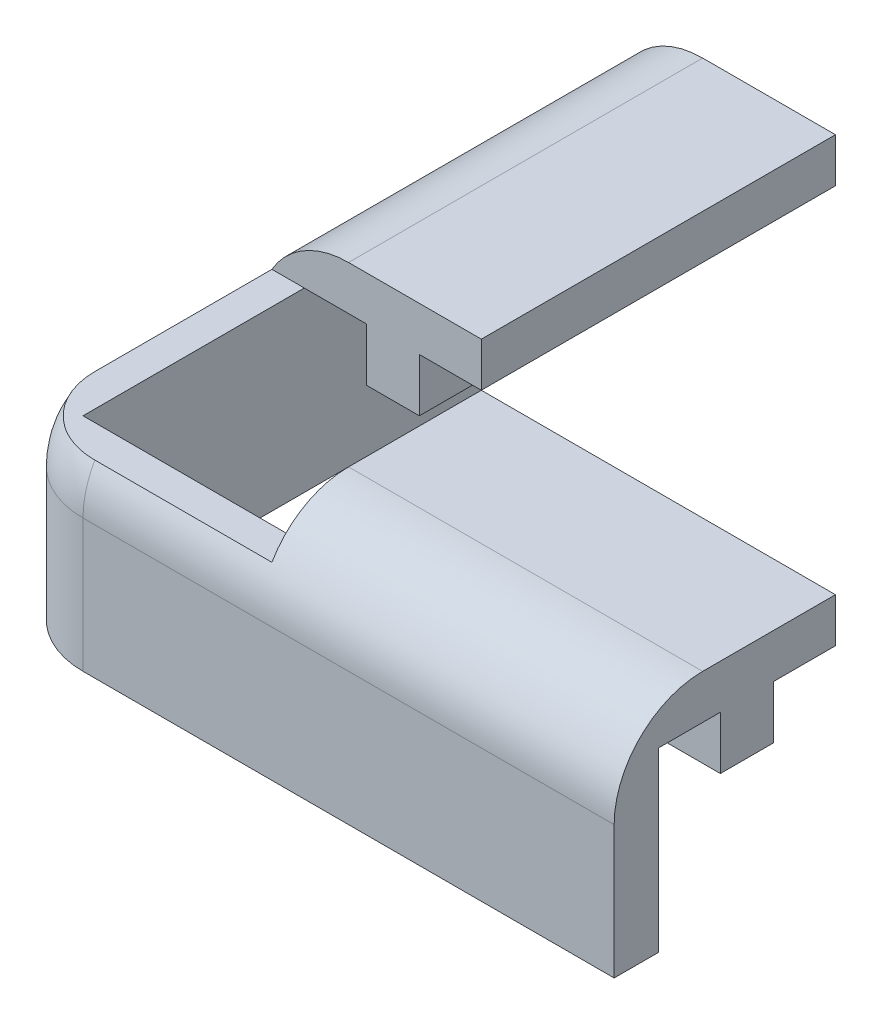
ISO-10303-21;
HEADER;
FILE_DESCRIPTION(('STEP AP214'),'2;1');
FILE_NAME('part.step','',(''),(''),'','','');
FILE_SCHEMA(('AUTOMOTIVE_DESIGN { 1 0 10303 214 1 1 1 1 }'));
ENDSEC;
DATA;
#1=APPLICATION_CONTEXT('core data for automotive mechanical design processes');
#2=APPLICATION_PROTOCOL_DEFINITION('international standard','automotive_design',2000,#1);
#3=PRODUCT_CONTEXT('',#1,'mechanical');
#4=PRODUCT('Part','Part','',(#3));
#5=PRODUCT_RELATED_PRODUCT_CATEGORY('part','',(#4));
#6=PRODUCT_DEFINITION_FORMATION('','',#4);
#7=PRODUCT_DEFINITION_CONTEXT('part definition',#1,'design');
#8=PRODUCT_DEFINITION('design','',#6,#7);
#9=PRODUCT_DEFINITION_SHAPE('','',#8);
#10=(LENGTH_UNIT() NAMED_UNIT(*) SI_UNIT(.MILLI.,.METRE.));
#11=(NAMED_UNIT(*) PLANE_ANGLE_UNIT() SI_UNIT($,.RADIAN.));
#12=(NAMED_UNIT(*) SI_UNIT($,.STERADIAN.) SOLID_ANGLE_UNIT());
#13=UNCERTAINTY_MEASURE_WITH_UNIT(LENGTH_MEASURE(1.E-05),#10,'distance_accuracy_value','');
#14=(GEOMETRIC_REPRESENTATION_CONTEXT(3) GLOBAL_UNCERTAINTY_ASSIGNED_CONTEXT((#13)) GLOBAL_UNIT_ASSIGNED_CONTEXT((#10,
#11,#12)) REPRESENTATION_CONTEXT('',''));
#15=CARTESIAN_POINT('',(0.,0.,0.));
#16=DIRECTION('',(0.,0.,1.));
#17=DIRECTION('',(1.,0.,0.));
#18=AXIS2_PLACEMENT_3D('',#15,#16,#17);
#19=CARTESIAN_POINT('',(10.,15.,-10.));
#20=DIRECTION('',(0.,0.,1.));
#21=DIRECTION('',(1.,0.,0.));
#22=AXIS2_PLACEMENT_3D('',#19,#20,#21);
#23=SPHERICAL_SURFACE('',#22,10.);
#24=CARTESIAN_POINT('',(10.,15.,-10.));
#25=DIRECTION('',(0.,-1.,0.));
#26=DIRECTION('',(0.,0.,-1.));
#27=AXIS2_PLACEMENT_3D('',#24,#25,#26);
#28=CIRCLE('',#27,10.);
#29=CARTESIAN_POINT('',(10.,15.,0.));
#30=VERTEX_POINT('',#29);
#31=CARTESIAN_POINT('',(0.,15.,-10.));
#32=VERTEX_POINT('',#31);
#33=EDGE_CURVE('E11',#30,#32,#28,.T.);
#34=ORIENTED_EDGE('',*,*,#33,.F.);
#35=CARTESIAN_POINT('',(10.,15.,-10.));
#36=DIRECTION('',(-1.,0.,0.));
#37=DIRECTION('',(0.,0.,1.));
#38=AXIS2_PLACEMENT_3D('',#35,#36,#37);
#39=CIRCLE('',#38,10.);
#40=CARTESIAN_POINT('',(10.,20.,-1.33974596215561));
#41=VERTEX_POINT('',#40);
#42=EDGE_CURVE('E338',#41,#30,#39,.F.);
#43=ORIENTED_EDGE('',*,*,#42,.F.);
#44=CARTESIAN_POINT('',(10.,20.,-10.));
#45=DIRECTION('',(0.,1.,0.));
#46=DIRECTION('',(0.,0.,1.));
#47=AXIS2_PLACEMENT_3D('',#44,#45,#46);
#48=CIRCLE('',#47,8.66025403784439);
#49=CARTESIAN_POINT('',(1.33974596215561,20.,-10.));
#50=VERTEX_POINT('',#49);
#51=EDGE_CURVE('E346',#50,#41,#48,.T.);
#52=ORIENTED_EDGE('',*,*,#51,.F.);
#53=CARTESIAN_POINT('',(10.,15.,-10.));
#54=DIRECTION('',(0.,0.,1.));
#55=DIRECTION('',(1.,0.,0.));
#56=AXIS2_PLACEMENT_3D('',#53,#54,#55);
#57=CIRCLE('',#56,10.);
#58=EDGE_CURVE('E342',#32,#50,#57,.F.);
#59=ORIENTED_EDGE('',*,*,#58,.F.);
#60=EDGE_LOOP('',(#34,#43,#52,#59));
#61=FACE_BOUND('',#60,.T.);
#62=ADVANCED_FACE('F45',(#61),#23,.T.);
#63=CARTESIAN_POINT('',(10.,0.,-10.));
#64=DIRECTION('',(0.,1.,0.));
#65=DIRECTION('',(0.,0.,1.));
#66=AXIS2_PLACEMENT_3D('',#63,#64,#65);
#67=CYLINDRICAL_SURFACE('',#66,10.);
#68=DIRECTION('',(0.,-1.,0.));
#69=VECTOR('',#68,1.);
#70=CARTESIAN_POINT('',(10.,0.,0.));
#71=LINE('',#70,#69);
#72=CARTESIAN_POINT('',(10.,0.,0.));
#73=VERTEX_POINT('',#72);
#74=EDGE_CURVE('E349',#30,#73,#71,.T.);
#75=ORIENTED_EDGE('',*,*,#74,.F.);
#76=ORIENTED_EDGE('',*,*,#33,.T.);
#77=DIRECTION('',(0.,-1.,0.));
#78=VECTOR('',#77,1.);
#79=CARTESIAN_POINT('',(0.,0.,-10.));
#80=LINE('',#79,#78);
#81=CARTESIAN_POINT('',(0.,0.,-10.));
#82=VERTEX_POINT('',#81);
#83=EDGE_CURVE('E352',#82,#32,#80,.F.);
#84=ORIENTED_EDGE('',*,*,#83,.F.);
#85=CARTESIAN_POINT('',(10.,0.,-10.));
#86=DIRECTION('',(0.,-1.,0.));
#87=DIRECTION('',(0.,0.,-1.));
#88=AXIS2_PLACEMENT_3D('',#85,#86,#87);
#89=CIRCLE('',#88,10.);
#90=EDGE_CURVE('E54',#73,#82,#89,.T.);
#91=ORIENTED_EDGE('',*,*,#90,.F.);
#92=EDGE_LOOP('',(#75,#76,#84,#91));
#93=FACE_BOUND('',#92,.T.);
#94=ADVANCED_FACE('F47',(#93),#67,.T.);
#95=CARTESIAN_POINT('',(0.,15.,-10.));
#96=DIRECTION('',(-1.,0.,0.));
#97=DIRECTION('',(0.,0.,1.));
#98=AXIS2_PLACEMENT_3D('',#95,#96,#97);
#99=CYLINDRICAL_SURFACE('',#98,10.);
#100=DIRECTION('',(-1.,0.,0.));
#101=VECTOR('',#100,1.);
#102=CARTESIAN_POINT('',(0.,20.,-1.33974596215561));
#103=LINE('',#102,#101);
#104=CARTESIAN_POINT('',(30.,20.,-1.33974596215561));
#105=VERTEX_POINT('',#104);
#106=EDGE_CURVE('E329',#41,#105,#103,.F.);
#107=ORIENTED_EDGE('',*,*,#106,.F.);
#108=ORIENTED_EDGE('',*,*,#42,.T.);
#109=DIRECTION('',(1.,0.,0.));
#110=VECTOR('',#109,1.);
#111=CARTESIAN_POINT('',(0.,15.,0.));
#112=LINE('',#111,#110);
#113=CARTESIAN_POINT('',(70.,15.,0.));
#114=VERTEX_POINT('',#113);
#115=EDGE_CURVE('E325',#114,#30,#112,.F.);
#116=ORIENTED_EDGE('',*,*,#115,.F.);
#117=CARTESIAN_POINT('',(70.,15.,-10.));
#118=DIRECTION('',(1.,0.,0.));
#119=DIRECTION('',(0.,0.,-1.));
#120=AXIS2_PLACEMENT_3D('',#117,#118,#119);
#121=CIRCLE('',#120,10.);
#122=CARTESIAN_POINT('',(70.,25.,-10.));
#123=VERTEX_POINT('',#122);
#124=EDGE_CURVE('E335',#123,#114,#121,.T.);
#125=ORIENTED_EDGE('',*,*,#124,.F.);
#126=DIRECTION('',(1.,0.,0.));
#127=VECTOR('',#126,1.);
#128=CARTESIAN_POINT('',(0.,25.,-10.));
#129=LINE('',#128,#127);
#130=CARTESIAN_POINT('',(30.,25.,-10.));
#131=VERTEX_POINT('',#130);
#132=EDGE_CURVE('E321',#131,#123,#129,.T.);
#133=ORIENTED_EDGE('',*,*,#132,.F.);
#134=CARTESIAN_POINT('',(30.,15.,-10.));
#135=DIRECTION('',(1.,0.,0.));
#136=DIRECTION('',(0.,0.,-1.));
#137=AXIS2_PLACEMENT_3D('',#134,#135,#136);
#138=CIRCLE('',#137,10.);
#139=EDGE_CURVE('E332',#105,#131,#138,.F.);
#140=ORIENTED_EDGE('',*,*,#139,.F.);
#141=EDGE_LOOP('',(#107,#108,#116,#125,#133,#140));
#142=FACE_BOUND('',#141,.T.);
#143=ADVANCED_FACE('F536',(#142),#99,.T.);
#144=CARTESIAN_POINT('',(10.,15.,0.));
#145=DIRECTION('',(0.,0.,1.));
#146=DIRECTION('',(1.,0.,0.));
#147=AXIS2_PLACEMENT_3D('',#144,#145,#146);
#148=CYLINDRICAL_SURFACE('',#147,10.);
#149=DIRECTION('',(0.,0.,1.));
#150=VECTOR('',#149,1.);
#151=CARTESIAN_POINT('',(0.,15.,-5.));
#152=LINE('',#151,#150);
#153=CARTESIAN_POINT('',(0.,15.,-70.));
#154=VERTEX_POINT('',#153);
#155=EDGE_CURVE('E315',#32,#154,#152,.F.);
#156=ORIENTED_EDGE('',*,*,#155,.F.);
#157=ORIENTED_EDGE('',*,*,#58,.T.);
#158=DIRECTION('',(0.,0.,1.));
#159=VECTOR('',#158,1.);
#160=CARTESIAN_POINT('',(1.33974596215561,20.,0.));
#161=LINE('',#160,#159);
#162=CARTESIAN_POINT('',(1.33974596215561,20.,-30.));
#163=VERTEX_POINT('',#162);
#164=EDGE_CURVE('E311',#163,#50,#161,.T.);
#165=ORIENTED_EDGE('',*,*,#164,.F.);
#166=CARTESIAN_POINT('',(10.,15.,-30.));
#167=DIRECTION('',(0.,0.,-1.));
#168=DIRECTION('',(-1.,0.,0.));
#169=AXIS2_PLACEMENT_3D('',#166,#167,#168);
#170=CIRCLE('',#169,10.);
#171=CARTESIAN_POINT('',(10.,25.,-30.));
#172=VERTEX_POINT('',#171);
#173=EDGE_CURVE('E307',#172,#163,#170,.F.);
#174=ORIENTED_EDGE('',*,*,#173,.F.);
#175=DIRECTION('',(0.,0.,1.));
#176=VECTOR('',#175,1.);
#177=CARTESIAN_POINT('',(10.,25.,0.));
#178=LINE('',#177,#176);
#179=CARTESIAN_POINT('',(10.,25.,-70.));
#180=VERTEX_POINT('',#179);
#181=EDGE_CURVE('E300',#180,#172,#178,.T.);
#182=ORIENTED_EDGE('',*,*,#181,.F.);
#183=CARTESIAN_POINT('',(10.,15.,-70.));
#184=DIRECTION('',(0.,0.,-1.));
#185=DIRECTION('',(-1.,0.,0.));
#186=AXIS2_PLACEMENT_3D('',#183,#184,#185);
#187=CIRCLE('',#186,10.);
#188=EDGE_CURVE('E318',#154,#180,#187,.T.);
#189=ORIENTED_EDGE('',*,*,#188,.F.);
#190=EDGE_LOOP('',(#156,#157,#165,#174,#182,#189));
#191=FACE_BOUND('',#190,.T.);
#192=ADVANCED_FACE('F540',(#191),#148,.T.);
#193=CARTESIAN_POINT('',(0.,20.,0.));
#194=DIRECTION('',(0.,1.,0.));
#195=DIRECTION('',(0.,0.,1.));
#196=AXIS2_PLACEMENT_3D('',#193,#194,#195);
#197=PLANE('',#196);
#198=DIRECTION('',(0.,0.,-1.));
#199=VECTOR('',#198,1.);
#200=CARTESIAN_POINT('',(12.,20.,-30.));
#201=LINE('',#200,#199);
#202=CARTESIAN_POINT('',(12.,20.,-30.));
#203=VERTEX_POINT('',#202);
#204=CARTESIAN_POINT('',(12.,20.,-70.));
#205=VERTEX_POINT('',#204);
#206=EDGE_CURVE('E205',#203,#205,#201,.T.);
#207=ORIENTED_EDGE('',*,*,#206,.F.);
#208=DIRECTION('',(1.,0.,0.));
#209=VECTOR('',#208,1.);
#210=CARTESIAN_POINT('',(0.,20.,-30.));
#211=LINE('',#210,#209);
#212=CARTESIAN_POINT('',(5.,20.,-30.));
#213=VERTEX_POINT('',#212);
#214=EDGE_CURVE('E373',#213,#203,#211,.T.);
#215=ORIENTED_EDGE('',*,*,#214,.F.);
#216=DIRECTION('',(0.,0.,-1.));
#217=VECTOR('',#216,1.);
#218=CARTESIAN_POINT('',(5.,20.,0.));
#219=LINE('',#218,#217);
#220=CARTESIAN_POINT('',(5.,20.,-70.));
#221=VERTEX_POINT('',#220);
#222=EDGE_CURVE('E233',#213,#221,#219,.T.);
#223=ORIENTED_EDGE('',*,*,#222,.T.);
#224=DIRECTION('',(-1.,0.,0.));
#225=VECTOR('',#224,1.);
#226=CARTESIAN_POINT('',(0.,20.,-70.));
#227=LINE('',#226,#225);
#228=EDGE_CURVE('E224',#205,#221,#227,.T.);
#229=ORIENTED_EDGE('',*,*,#228,.F.);
#230=EDGE_LOOP('',(#207,#215,#223,#229));
#231=FACE_BOUND('',#230,.T.);
#232=ADVANCED_FACE('F231',(#231),#197,.F.);
#233=CARTESIAN_POINT('',(0.,20.,0.));
#234=DIRECTION('',(0.,1.,0.));
#235=DIRECTION('',(0.,0.,1.));
#236=AXIS2_PLACEMENT_3D('',#233,#234,#235);
#237=PLANE('',#236);
#238=DIRECTION('',(1.,0.,0.));
#239=VECTOR('',#238,1.);
#240=CARTESIAN_POINT('',(30.,20.,-18.));
#241=LINE('',#240,#239);
#242=CARTESIAN_POINT('',(30.,20.,-18.));
#243=VERTEX_POINT('',#242);
#244=CARTESIAN_POINT('',(70.,20.,-18.));
#245=VERTEX_POINT('',#244);
#246=EDGE_CURVE('E432',#243,#245,#241,.T.);
#247=ORIENTED_EDGE('',*,*,#246,.F.);
#248=DIRECTION('',(0.,0.,1.));
#249=VECTOR('',#248,1.);
#250=CARTESIAN_POINT('',(30.,20.,0.));
#251=LINE('',#250,#249);
#252=CARTESIAN_POINT('',(30.,20.,-25.));
#253=VERTEX_POINT('',#252);
#254=EDGE_CURVE('E407',#253,#243,#251,.T.);
#255=ORIENTED_EDGE('',*,*,#254,.F.);
#256=DIRECTION('',(-1.,0.,0.));
#257=VECTOR('',#256,1.);
#258=CARTESIAN_POINT('',(70.,20.,-25.));
#259=LINE('',#258,#257);
#260=CARTESIAN_POINT('',(70.,20.,-25.));
#261=VERTEX_POINT('',#260);
#262=EDGE_CURVE('E388',#261,#253,#259,.T.);
#263=ORIENTED_EDGE('',*,*,#262,.F.);
#264=DIRECTION('',(0.,0.,-1.));
#265=VECTOR('',#264,1.);
#266=CARTESIAN_POINT('',(70.,20.,0.));
#267=LINE('',#266,#265);
#268=EDGE_CURVE('E384',#245,#261,#267,.T.);
#269=ORIENTED_EDGE('',*,*,#268,.F.);
#270=EDGE_LOOP('',(#247,#255,#263,#269));
#271=FACE_BOUND('',#270,.T.);
#272=ADVANCED_FACE('F430',(#271),#237,.F.);
#273=CARTESIAN_POINT('',(0.,20.,-5.));
#274=DIRECTION('',(0.,1.,0.));
#275=DIRECTION('',(0.,0.,1.));
#276=AXIS2_PLACEMENT_3D('',#273,#274,#275);
#277=PLANE('',#276);
#278=ORIENTED_EDGE('',*,*,#164,.T.);
#279=ORIENTED_EDGE('',*,*,#51,.T.);
#280=ORIENTED_EDGE('',*,*,#106,.T.);
#281=CARTESIAN_POINT('',(30.,20.,-5.));
#282=VERTEX_POINT('',#281);
#283=EDGE_CURVE('E402',#282,#105,#251,.T.);
#284=ORIENTED_EDGE('',*,*,#283,.F.);
#285=DIRECTION('',(-1.,0.,0.));
#286=VECTOR('',#285,1.);
#287=CARTESIAN_POINT('',(0.,20.,-5.));
#288=LINE('',#287,#286);
#289=CARTESIAN_POINT('',(5.,20.,-5.));
#290=VERTEX_POINT('',#289);
#291=EDGE_CURVE('E285',#282,#290,#288,.T.);
#292=ORIENTED_EDGE('',*,*,#291,.T.);
#293=EDGE_CURVE('E256',#290,#213,#219,.T.);
#294=ORIENTED_EDGE('',*,*,#293,.T.);
#295=EDGE_CURVE('E242',#163,#213,#211,.T.);
#296=ORIENTED_EDGE('',*,*,#295,.F.);
#297=EDGE_LOOP('',(#278,#279,#280,#284,#292,#294,#296));
#298=FACE_BOUND('',#297,.T.);
#299=ADVANCED_FACE('F512',(#298),#277,.T.);
#300=CARTESIAN_POINT('',(0.,0.,-5.));
#301=DIRECTION('',(-1.,0.,0.));
#302=DIRECTION('',(0.,0.,1.));
#303=AXIS2_PLACEMENT_3D('',#300,#301,#302);
#304=PLANE('',#303);
#305=DIRECTION('',(0.,0.,1.));
#306=VECTOR('',#305,1.);
#307=CARTESIAN_POINT('',(0.,0.,-5.));
#308=LINE('',#307,#306);
#309=CARTESIAN_POINT('',(0.,0.,-70.));
#310=VERTEX_POINT('',#309);
#311=EDGE_CURVE('E290',#310,#82,#308,.T.);
#312=ORIENTED_EDGE('',*,*,#311,.T.);
#313=ORIENTED_EDGE('',*,*,#83,.T.);
#314=ORIENTED_EDGE('',*,*,#155,.T.);
#315=DIRECTION('',(0.,-1.,0.));
#316=VECTOR('',#315,1.);
#317=CARTESIAN_POINT('',(0.,20.,-70.));
#318=LINE('',#317,#316);
#319=EDGE_CURVE('E255',#154,#310,#318,.T.);
#320=ORIENTED_EDGE('',*,*,#319,.T.);
#321=EDGE_LOOP('',(#312,#313,#314,#320));
#322=FACE_BOUND('',#321,.T.);
#323=ADVANCED_FACE('F544',(#322),#304,.T.);
#324=CARTESIAN_POINT('',(70.,0.,-5.));
#325=DIRECTION('',(1.,0.,0.));
#326=DIRECTION('',(0.,0.,-1.));
#327=AXIS2_PLACEMENT_3D('',#324,#325,#326);
#328=PLANE('',#327);
#329=DIRECTION('',(0.,0.,-1.));
#330=VECTOR('',#329,1.);
#331=CARTESIAN_POINT('',(70.,25.,0.));
#332=LINE('',#331,#330);
#333=CARTESIAN_POINT('',(70.,25.,-25.));
#334=VERTEX_POINT('',#333);
#335=EDGE_CURVE('E370',#123,#334,#332,.T.);
#336=ORIENTED_EDGE('',*,*,#335,.F.);
#337=ORIENTED_EDGE('',*,*,#124,.T.);
#338=DIRECTION('',(0.,1.,0.));
#339=VECTOR('',#338,1.);
#340=CARTESIAN_POINT('',(70.,0.,0.));
#341=LINE('',#340,#339);
#342=CARTESIAN_POINT('',(70.,0.,0.));
#343=VERTEX_POINT('',#342);
#344=EDGE_CURVE('E281',#343,#114,#341,.T.);
#345=ORIENTED_EDGE('',*,*,#344,.F.);
#346=DIRECTION('',(0.,0.,1.));
#347=VECTOR('',#346,1.);
#348=CARTESIAN_POINT('',(70.,0.,-5.));
#349=LINE('',#348,#347);
#350=CARTESIAN_POINT('',(70.,0.,-5.));
#351=VERTEX_POINT('',#350);
#352=EDGE_CURVE('E296',#351,#343,#349,.T.);
#353=ORIENTED_EDGE('',*,*,#352,.F.);
#354=DIRECTION('',(0.,1.,0.));
#355=VECTOR('',#354,1.);
#356=CARTESIAN_POINT('',(70.,0.,-5.));
#357=LINE('',#356,#355);
#358=CARTESIAN_POINT('',(70.,20.,-5.));
#359=VERTEX_POINT('',#358);
#360=EDGE_CURVE('E280',#351,#359,#357,.T.);
#361=ORIENTED_EDGE('',*,*,#360,.T.);
#362=CARTESIAN_POINT('',(70.,20.,-12.));
#363=VERTEX_POINT('',#362);
#364=EDGE_CURVE('E379',#359,#363,#267,.T.);
#365=ORIENTED_EDGE('',*,*,#364,.T.);
#366=DIRECTION('',(0.,1.,0.));
#367=VECTOR('',#366,1.);
#368=CARTESIAN_POINT('',(70.,14.,-12.));
#369=LINE('',#368,#367);
#370=CARTESIAN_POINT('',(70.,14.,-12.));
#371=VERTEX_POINT('',#370);
#372=EDGE_CURVE('E456',#371,#363,#369,.T.);
#373=ORIENTED_EDGE('',*,*,#372,.F.);
#374=DIRECTION('',(0.,0.,-1.));
#375=VECTOR('',#374,1.);
#376=CARTESIAN_POINT('',(70.,14.,-12.));
#377=LINE('',#376,#375);
#378=CARTESIAN_POINT('',(70.,14.,-18.));
#379=VERTEX_POINT('',#378);
#380=EDGE_CURVE('E468',#371,#379,#377,.T.);
#381=ORIENTED_EDGE('',*,*,#380,.T.);
#382=DIRECTION('',(0.,1.,0.));
#383=VECTOR('',#382,1.);
#384=CARTESIAN_POINT('',(70.,14.,-18.));
#385=LINE('',#384,#383);
#386=EDGE_CURVE('E459',#379,#245,#385,.T.);
#387=ORIENTED_EDGE('',*,*,#386,.T.);
#388=ORIENTED_EDGE('',*,*,#268,.T.);
#389=DIRECTION('',(0.,-1.,0.));
#390=VECTOR('',#389,1.);
#391=CARTESIAN_POINT('',(70.,25.,-25.));
#392=LINE('',#391,#390);
#393=EDGE_CURVE('E424',#334,#261,#392,.T.);
#394=ORIENTED_EDGE('',*,*,#393,.F.);
#395=EDGE_LOOP('',(#336,#337,#345,#353,#361,#365,#373,#381,#387,#388,#394));
#396=FACE_BOUND('',#395,.T.);
#397=ADVANCED_FACE('F547',(#396),#328,.T.);
#398=CARTESIAN_POINT('',(0.,0.,-5.));
#399=DIRECTION('',(0.,-1.,0.));
#400=DIRECTION('',(0.,0.,-1.));
#401=AXIS2_PLACEMENT_3D('',#398,#399,#400);
#402=PLANE('',#401);
#403=DIRECTION('',(1.,0.,0.));
#404=VECTOR('',#403,1.);
#405=CARTESIAN_POINT('',(0.,0.,0.));
#406=LINE('',#405,#404);
#407=EDGE_CURVE('E276',#73,#343,#406,.T.);
#408=ORIENTED_EDGE('',*,*,#407,.F.);
#409=ORIENTED_EDGE('',*,*,#90,.T.);
#410=ORIENTED_EDGE('',*,*,#311,.F.);
#411=DIRECTION('',(-1.,0.,0.));
#412=VECTOR('',#411,1.);
#413=CARTESIAN_POINT('',(5.,0.,-70.));
#414=LINE('',#413,#412);
#415=CARTESIAN_POINT('',(5.,0.,-70.));
#416=VERTEX_POINT('',#415);
#417=EDGE_CURVE('E267',#416,#310,#414,.T.);
#418=ORIENTED_EDGE('',*,*,#417,.F.);
#419=DIRECTION('',(0.,0.,1.));
#420=VECTOR('',#419,1.);
#421=CARTESIAN_POINT('',(5.,0.,0.));
#422=LINE('',#421,#420);
#423=CARTESIAN_POINT('',(5.,0.,-5.));
#424=VERTEX_POINT('',#423);
#425=EDGE_CURVE('E263',#416,#424,#422,.T.);
#426=ORIENTED_EDGE('',*,*,#425,.T.);
#427=DIRECTION('',(1.,0.,0.));
#428=VECTOR('',#427,1.);
#429=CARTESIAN_POINT('',(0.,0.,-5.));
#430=LINE('',#429,#428);
#431=EDGE_CURVE('E277',#424,#351,#430,.T.);
#432=ORIENTED_EDGE('',*,*,#431,.T.);
#433=ORIENTED_EDGE('',*,*,#352,.T.);
#434=EDGE_LOOP('',(#408,#409,#410,#418,#426,#432,#433));
#435=FACE_BOUND('',#434,.T.);
#436=ADVANCED_FACE('F549',(#435),#402,.T.);
#437=CARTESIAN_POINT('',(0.,0.,-5.));
#438=DIRECTION('',(0.,0.,-1.));
#439=DIRECTION('',(-1.,0.,0.));
#440=AXIS2_PLACEMENT_3D('',#437,#438,#439);
#441=PLANE('',#440);
#442=DIRECTION('',(0.,-1.,0.));
#443=VECTOR('',#442,1.);
#444=CARTESIAN_POINT('',(5.,0.,-5.));
#445=LINE('',#444,#443);
#446=EDGE_CURVE('E273',#290,#424,#445,.T.);
#447=ORIENTED_EDGE('',*,*,#446,.F.);
#448=ORIENTED_EDGE('',*,*,#291,.F.);
#449=EDGE_CURVE('E286',#359,#282,#288,.T.);
#450=ORIENTED_EDGE('',*,*,#449,.F.);
#451=ORIENTED_EDGE('',*,*,#360,.F.);
#452=ORIENTED_EDGE('',*,*,#431,.F.);
#453=EDGE_LOOP('',(#447,#448,#450,#451,#452));
#454=FACE_BOUND('',#453,.T.);
#455=ADVANCED_FACE('F552',(#454),#441,.T.);
#456=CARTESIAN_POINT('',(0.,0.,0.));
#457=DIRECTION('',(0.,0.,-1.));
#458=DIRECTION('',(-1.,0.,0.));
#459=AXIS2_PLACEMENT_3D('',#456,#457,#458);
#460=PLANE('',#459);
#461=ORIENTED_EDGE('',*,*,#115,.T.);
#462=ORIENTED_EDGE('',*,*,#74,.T.);
#463=ORIENTED_EDGE('',*,*,#407,.T.);
#464=ORIENTED_EDGE('',*,*,#344,.T.);
#465=EDGE_LOOP('',(#461,#462,#463,#464));
#466=FACE_BOUND('',#465,.T.);
#467=ADVANCED_FACE('F557',(#466),#460,.F.);
#468=CARTESIAN_POINT('',(5.,20.,-70.));
#469=DIRECTION('',(0.,0.,-1.));
#470=DIRECTION('',(-1.,0.,0.));
#471=AXIS2_PLACEMENT_3D('',#468,#469,#470);
#472=PLANE('',#471);
#473=ORIENTED_EDGE('',*,*,#319,.F.);
#474=ORIENTED_EDGE('',*,*,#188,.T.);
#475=DIRECTION('',(-1.,0.,0.));
#476=VECTOR('',#475,1.);
#477=CARTESIAN_POINT('',(0.,25.,-70.));
#478=LINE('',#477,#476);
#479=CARTESIAN_POINT('',(25.,25.,-70.));
#480=VERTEX_POINT('',#479);
#481=EDGE_CURVE('E251',#480,#180,#478,.T.);
#482=ORIENTED_EDGE('',*,*,#481,.F.);
#483=DIRECTION('',(0.,-1.,0.));
#484=VECTOR('',#483,1.);
#485=CARTESIAN_POINT('',(25.,25.,-70.));
#486=LINE('',#485,#484);
#487=CARTESIAN_POINT('',(25.,20.,-70.));
#488=VERTEX_POINT('',#487);
#489=EDGE_CURVE('E246',#480,#488,#486,.T.);
#490=ORIENTED_EDGE('',*,*,#489,.T.);
#491=CARTESIAN_POINT('',(18.,20.,-70.));
#492=VERTEX_POINT('',#491);
#493=EDGE_CURVE('E235',#488,#492,#227,.T.);
#494=ORIENTED_EDGE('',*,*,#493,.T.);
#495=DIRECTION('',(0.,1.,0.));
#496=VECTOR('',#495,1.);
#497=CARTESIAN_POINT('',(18.,14.,-70.));
#498=LINE('',#497,#496);
#499=CARTESIAN_POINT('',(18.,14.,-70.));
#500=VERTEX_POINT('',#499);
#501=EDGE_CURVE('E494',#500,#492,#498,.T.);
#502=ORIENTED_EDGE('',*,*,#501,.F.);
#503=DIRECTION('',(1.,0.,0.));
#504=VECTOR('',#503,1.);
#505=CARTESIAN_POINT('',(12.,14.,-70.));
#506=LINE('',#505,#504);
#507=CARTESIAN_POINT('',(12.,14.,-70.));
#508=VERTEX_POINT('',#507);
#509=EDGE_CURVE('E218',#508,#500,#506,.T.);
#510=ORIENTED_EDGE('',*,*,#509,.F.);
#511=DIRECTION('',(0.,1.,0.));
#512=VECTOR('',#511,1.);
#513=CARTESIAN_POINT('',(12.,14.,-70.));
#514=LINE('',#513,#512);
#515=EDGE_CURVE('E209',#508,#205,#514,.T.);
#516=ORIENTED_EDGE('',*,*,#515,.T.);
#517=ORIENTED_EDGE('',*,*,#228,.T.);
#518=DIRECTION('',(0.,-1.,0.));
#519=VECTOR('',#518,1.);
#520=CARTESIAN_POINT('',(5.,20.,-70.));
#521=LINE('',#520,#519);
#522=EDGE_CURVE('E260',#221,#416,#521,.T.);
#523=ORIENTED_EDGE('',*,*,#522,.T.);
#524=ORIENTED_EDGE('',*,*,#417,.T.);
#525=EDGE_LOOP('',(#473,#474,#482,#490,#494,#502,#510,#516,#517,#523,#524));
#526=FACE_BOUND('',#525,.T.);
#527=ADVANCED_FACE('F222',(#526),#472,.T.);
#528=CARTESIAN_POINT('',(5.,0.,0.));
#529=DIRECTION('',(1.,0.,0.));
#530=DIRECTION('',(0.,0.,-1.));
#531=AXIS2_PLACEMENT_3D('',#528,#529,#530);
#532=PLANE('',#531);
#533=ORIENTED_EDGE('',*,*,#293,.F.);
#534=ORIENTED_EDGE('',*,*,#446,.T.);
#535=ORIENTED_EDGE('',*,*,#425,.F.);
#536=ORIENTED_EDGE('',*,*,#522,.F.);
#537=ORIENTED_EDGE('',*,*,#222,.F.);
#538=EDGE_LOOP('',(#533,#534,#535,#536,#537));
#539=FACE_BOUND('',#538,.T.);
#540=ADVANCED_FACE('F517',(#539),#532,.T.);
#541=CARTESIAN_POINT('',(18.,20.,-30.));
#542=VERTEX_POINT('',#541);
#543=CARTESIAN_POINT('',(25.,20.,-30.));
#544=VERTEX_POINT('',#543);
#545=EDGE_CURVE('E374',#542,#544,#211,.T.);
#546=ORIENTED_EDGE('',*,*,#545,.F.);
#547=DIRECTION('',(0.,0.,-1.));
#548=VECTOR('',#547,1.);
#549=CARTESIAN_POINT('',(18.,20.,-30.));
#550=LINE('',#549,#548);
#551=EDGE_CURVE('E217',#542,#492,#550,.T.);
#552=ORIENTED_EDGE('',*,*,#551,.T.);
#553=ORIENTED_EDGE('',*,*,#493,.F.);
#554=DIRECTION('',(0.,0.,-1.));
#555=VECTOR('',#554,1.);
#556=CARTESIAN_POINT('',(25.,20.,-70.));
#557=LINE('',#556,#555);
#558=EDGE_CURVE('E236',#544,#488,#557,.T.);
#559=ORIENTED_EDGE('',*,*,#558,.F.);
#560=EDGE_LOOP('',(#546,#552,#553,#559));
#561=FACE_BOUND('',#560,.T.);
#562=ADVANCED_FACE('F501',(#561),#197,.F.);
#563=CARTESIAN_POINT('',(0.,25.,-30.));
#564=DIRECTION('',(0.,0.,-1.));
#565=DIRECTION('',(-1.,0.,0.));
#566=AXIS2_PLACEMENT_3D('',#563,#564,#565);
#567=PLANE('',#566);
#568=DIRECTION('',(1.,0.,0.));
#569=VECTOR('',#568,1.);
#570=CARTESIAN_POINT('',(0.,25.,-30.));
#571=LINE('',#570,#569);
#572=CARTESIAN_POINT('',(25.,25.,-30.));
#573=VERTEX_POINT('',#572);
#574=EDGE_CURVE('E241',#172,#573,#571,.T.);
#575=ORIENTED_EDGE('',*,*,#574,.F.);
#576=ORIENTED_EDGE('',*,*,#173,.T.);
#577=ORIENTED_EDGE('',*,*,#295,.T.);
#578=ORIENTED_EDGE('',*,*,#214,.T.);
#579=DIRECTION('',(0.,1.,0.));
#580=VECTOR('',#579,1.);
#581=CARTESIAN_POINT('',(12.,14.,-30.));
#582=LINE('',#581,#580);
#583=CARTESIAN_POINT('',(12.,14.,-30.));
#584=VERTEX_POINT('',#583);
#585=EDGE_CURVE('E211',#584,#203,#582,.T.);
#586=ORIENTED_EDGE('',*,*,#585,.F.);
#587=DIRECTION('',(1.,0.,0.));
#588=VECTOR('',#587,1.);
#589=CARTESIAN_POINT('',(12.,14.,-30.));
#590=LINE('',#589,#588);
#591=CARTESIAN_POINT('',(18.,14.,-30.));
#592=VERTEX_POINT('',#591);
#593=EDGE_CURVE('E483',#584,#592,#590,.T.);
#594=ORIENTED_EDGE('',*,*,#593,.T.);
#595=DIRECTION('',(0.,1.,0.));
#596=VECTOR('',#595,1.);
#597=CARTESIAN_POINT('',(18.,14.,-30.));
#598=LINE('',#597,#596);
#599=EDGE_CURVE('E491',#592,#542,#598,.T.);
#600=ORIENTED_EDGE('',*,*,#599,.T.);
#601=ORIENTED_EDGE('',*,*,#545,.T.);
#602=DIRECTION('',(0.,-1.,0.));
#603=VECTOR('',#602,1.);
#604=CARTESIAN_POINT('',(25.,25.,-30.));
#605=LINE('',#604,#603);
#606=EDGE_CURVE('E250',#573,#544,#605,.T.);
#607=ORIENTED_EDGE('',*,*,#606,.F.);
#608=EDGE_LOOP('',(#575,#576,#577,#578,#586,#594,#600,#601,#607));
#609=FACE_BOUND('',#608,.T.);
#610=ADVANCED_FACE('F508',(#609),#567,.F.);
#611=CARTESIAN_POINT('',(25.,25.,-70.));
#612=DIRECTION('',(-1.,0.,0.));
#613=DIRECTION('',(0.,0.,1.));
#614=AXIS2_PLACEMENT_3D('',#611,#612,#613);
#615=PLANE('',#614);
#616=ORIENTED_EDGE('',*,*,#558,.T.);
#617=ORIENTED_EDGE('',*,*,#489,.F.);
#618=DIRECTION('',(0.,0.,-1.));
#619=VECTOR('',#618,1.);
#620=CARTESIAN_POINT('',(25.,25.,-70.));
#621=LINE('',#620,#619);
#622=EDGE_CURVE('E361',#573,#480,#621,.T.);
#623=ORIENTED_EDGE('',*,*,#622,.F.);
#624=ORIENTED_EDGE('',*,*,#606,.T.);
#625=EDGE_LOOP('',(#616,#617,#623,#624));
#626=FACE_BOUND('',#625,.T.);
#627=ADVANCED_FACE('F507',(#626),#615,.F.);
#628=CARTESIAN_POINT('',(0.,25.,0.));
#629=DIRECTION('',(0.,1.,0.));
#630=DIRECTION('',(0.,0.,1.));
#631=AXIS2_PLACEMENT_3D('',#628,#629,#630);
#632=PLANE('',#631);
#633=ORIENTED_EDGE('',*,*,#481,.T.);
#634=ORIENTED_EDGE('',*,*,#181,.T.);
#635=ORIENTED_EDGE('',*,*,#574,.T.);
#636=ORIENTED_EDGE('',*,*,#622,.T.);
#637=EDGE_LOOP('',(#633,#634,#635,#636));
#638=FACE_BOUND('',#637,.T.);
#639=ADVANCED_FACE('F571',(#638),#632,.T.);
#640=CARTESIAN_POINT('',(70.,25.,-25.));
#641=DIRECTION('',(0.,0.,1.));
#642=DIRECTION('',(1.,0.,0.));
#643=AXIS2_PLACEMENT_3D('',#640,#641,#642);
#644=PLANE('',#643);
#645=ORIENTED_EDGE('',*,*,#262,.T.);
#646=DIRECTION('',(0.,-1.,0.));
#647=VECTOR('',#646,1.);
#648=CARTESIAN_POINT('',(30.,25.,-25.));
#649=LINE('',#648,#647);
#650=CARTESIAN_POINT('',(30.,25.,-25.));
#651=VERTEX_POINT('',#650);
#652=EDGE_CURVE('E396',#651,#253,#649,.T.);
#653=ORIENTED_EDGE('',*,*,#652,.F.);
#654=DIRECTION('',(-1.,0.,0.));
#655=VECTOR('',#654,1.);
#656=CARTESIAN_POINT('',(70.,25.,-25.));
#657=LINE('',#656,#655);
#658=EDGE_CURVE('E395',#334,#651,#657,.T.);
#659=ORIENTED_EDGE('',*,*,#658,.F.);
#660=ORIENTED_EDGE('',*,*,#393,.T.);
#661=EDGE_LOOP('',(#645,#653,#659,#660));
#662=FACE_BOUND('',#661,.T.);
#663=ADVANCED_FACE('F421',(#662),#644,.F.);
#664=CARTESIAN_POINT('',(30.,25.,0.));
#665=DIRECTION('',(1.,0.,0.));
#666=DIRECTION('',(0.,0.,-1.));
#667=AXIS2_PLACEMENT_3D('',#664,#665,#666);
#668=PLANE('',#667);
#669=ORIENTED_EDGE('',*,*,#283,.T.);
#670=ORIENTED_EDGE('',*,*,#139,.T.);
#671=DIRECTION('',(0.,0.,1.));
#672=VECTOR('',#671,1.);
#673=CARTESIAN_POINT('',(30.,25.,0.));
#674=LINE('',#673,#672);
#675=EDGE_CURVE('E392',#651,#131,#674,.T.);
#676=ORIENTED_EDGE('',*,*,#675,.F.);
#677=ORIENTED_EDGE('',*,*,#652,.T.);
#678=ORIENTED_EDGE('',*,*,#254,.T.);
#679=DIRECTION('',(0.,1.,0.));
#680=VECTOR('',#679,1.);
#681=CARTESIAN_POINT('',(30.,14.,-18.));
#682=LINE('',#681,#680);
#683=CARTESIAN_POINT('',(30.,14.,-18.));
#684=VERTEX_POINT('',#683);
#685=EDGE_CURVE('E449',#684,#243,#682,.T.);
#686=ORIENTED_EDGE('',*,*,#685,.F.);
#687=DIRECTION('',(0.,0.,-1.));
#688=VECTOR('',#687,1.);
#689=CARTESIAN_POINT('',(30.,14.,-12.));
#690=LINE('',#689,#688);
#691=CARTESIAN_POINT('',(30.,14.,-12.));
#692=VERTEX_POINT('',#691);
#693=EDGE_CURVE('E446',#692,#684,#690,.T.);
#694=ORIENTED_EDGE('',*,*,#693,.F.);
#695=DIRECTION('',(0.,1.,0.));
#696=VECTOR('',#695,1.);
#697=CARTESIAN_POINT('',(30.,14.,-12.));
#698=LINE('',#697,#696);
#699=CARTESIAN_POINT('',(30.,20.,-12.));
#700=VERTEX_POINT('',#699);
#701=EDGE_CURVE('E452',#692,#700,#698,.T.);
#702=ORIENTED_EDGE('',*,*,#701,.T.);
#703=EDGE_CURVE('E406',#700,#282,#251,.T.);
#704=ORIENTED_EDGE('',*,*,#703,.T.);
#705=EDGE_LOOP('',(#669,#670,#676,#677,#678,#686,#694,#702,#704));
#706=FACE_BOUND('',#705,.T.);
#707=ADVANCED_FACE('F427',(#706),#668,.F.);
#708=CARTESIAN_POINT('',(0.,25.,0.));
#709=DIRECTION('',(0.,1.,0.));
#710=DIRECTION('',(0.,0.,1.));
#711=AXIS2_PLACEMENT_3D('',#708,#709,#710);
#712=PLANE('',#711);
#713=ORIENTED_EDGE('',*,*,#675,.T.);
#714=ORIENTED_EDGE('',*,*,#132,.T.);
#715=ORIENTED_EDGE('',*,*,#335,.T.);
#716=ORIENTED_EDGE('',*,*,#658,.T.);
#717=EDGE_LOOP('',(#713,#714,#715,#716));
#718=FACE_BOUND('',#717,.T.);
#719=ADVANCED_FACE('F576',(#718),#712,.T.);
#720=ORIENTED_EDGE('',*,*,#703,.F.);
#721=DIRECTION('',(1.,0.,0.));
#722=VECTOR('',#721,1.);
#723=CARTESIAN_POINT('',(30.,20.,-12.));
#724=LINE('',#723,#722);
#725=EDGE_CURVE('E436',#700,#363,#724,.T.);
#726=ORIENTED_EDGE('',*,*,#725,.T.);
#727=ORIENTED_EDGE('',*,*,#364,.F.);
#728=ORIENTED_EDGE('',*,*,#449,.T.);
#729=EDGE_LOOP('',(#720,#726,#727,#728));
#730=FACE_BOUND('',#729,.T.);
#731=ADVANCED_FACE('F578',(#730),#237,.F.);
#732=CARTESIAN_POINT('',(30.,14.,-18.));
#733=DIRECTION('',(0.,0.,1.));
#734=DIRECTION('',(1.,0.,0.));
#735=AXIS2_PLACEMENT_3D('',#732,#733,#734);
#736=PLANE('',#735);
#737=ORIENTED_EDGE('',*,*,#246,.T.);
#738=ORIENTED_EDGE('',*,*,#386,.F.);
#739=DIRECTION('',(1.,0.,0.));
#740=VECTOR('',#739,1.);
#741=CARTESIAN_POINT('',(30.,14.,-18.));
#742=LINE('',#741,#740);
#743=EDGE_CURVE('E441',#684,#379,#742,.T.);
#744=ORIENTED_EDGE('',*,*,#743,.F.);
#745=ORIENTED_EDGE('',*,*,#685,.T.);
#746=EDGE_LOOP('',(#737,#738,#744,#745));
#747=FACE_BOUND('',#746,.T.);
#748=ADVANCED_FACE('F581',(#747),#736,.F.);
#749=CARTESIAN_POINT('',(30.,14.,-12.));
#750=DIRECTION('',(0.,0.,1.));
#751=DIRECTION('',(1.,0.,0.));
#752=AXIS2_PLACEMENT_3D('',#749,#750,#751);
#753=PLANE('',#752);
#754=ORIENTED_EDGE('',*,*,#725,.F.);
#755=ORIENTED_EDGE('',*,*,#701,.F.);
#756=DIRECTION('',(1.,0.,0.));
#757=VECTOR('',#756,1.);
#758=CARTESIAN_POINT('',(30.,14.,-12.));
#759=LINE('',#758,#757);
#760=EDGE_CURVE('E465',#692,#371,#759,.T.);
#761=ORIENTED_EDGE('',*,*,#760,.T.);
#762=ORIENTED_EDGE('',*,*,#372,.T.);
#763=EDGE_LOOP('',(#754,#755,#761,#762));
#764=FACE_BOUND('',#763,.T.);
#765=ADVANCED_FACE('F589',(#764),#753,.T.);
#766=CARTESIAN_POINT('',(0.,14.,0.));
#767=DIRECTION('',(0.,1.,0.));
#768=DIRECTION('',(0.,0.,1.));
#769=AXIS2_PLACEMENT_3D('',#766,#767,#768);
#770=PLANE('',#769);
#771=ORIENTED_EDGE('',*,*,#743,.T.);
#772=ORIENTED_EDGE('',*,*,#380,.F.);
#773=ORIENTED_EDGE('',*,*,#760,.F.);
#774=ORIENTED_EDGE('',*,*,#693,.T.);
#775=EDGE_LOOP('',(#771,#772,#773,#774));
#776=FACE_BOUND('',#775,.T.);
#777=ADVANCED_FACE('F591',(#776),#770,.F.);
#778=CARTESIAN_POINT('',(18.,14.,-30.));
#779=DIRECTION('',(1.,0.,0.));
#780=DIRECTION('',(0.,0.,-1.));
#781=AXIS2_PLACEMENT_3D('',#778,#779,#780);
#782=PLANE('',#781);
#783=ORIENTED_EDGE('',*,*,#551,.F.);
#784=ORIENTED_EDGE('',*,*,#599,.F.);
#785=DIRECTION('',(0.,0.,-1.));
#786=VECTOR('',#785,1.);
#787=CARTESIAN_POINT('',(18.,14.,-30.));
#788=LINE('',#787,#786);
#789=EDGE_CURVE('E479',#592,#500,#788,.T.);
#790=ORIENTED_EDGE('',*,*,#789,.T.);
#791=ORIENTED_EDGE('',*,*,#501,.T.);
#792=EDGE_LOOP('',(#783,#784,#790,#791));
#793=FACE_BOUND('',#792,.T.);
#794=ADVANCED_FACE('F497',(#793),#782,.T.);
#795=CARTESIAN_POINT('',(12.,14.,-30.));
#796=DIRECTION('',(1.,0.,0.));
#797=DIRECTION('',(0.,0.,-1.));
#798=AXIS2_PLACEMENT_3D('',#795,#796,#797);
#799=PLANE('',#798);
#800=ORIENTED_EDGE('',*,*,#206,.T.);
#801=ORIENTED_EDGE('',*,*,#515,.F.);
#802=DIRECTION('',(0.,0.,-1.));
#803=VECTOR('',#802,1.);
#804=CARTESIAN_POINT('',(12.,14.,-30.));
#805=LINE('',#804,#803);
#806=EDGE_CURVE('E228',#584,#508,#805,.T.);
#807=ORIENTED_EDGE('',*,*,#806,.F.);
#808=ORIENTED_EDGE('',*,*,#585,.T.);
#809=EDGE_LOOP('',(#800,#801,#807,#808));
#810=FACE_BOUND('',#809,.T.);
#811=ADVANCED_FACE('F207',(#810),#799,.F.);
#812=CARTESIAN_POINT('',(0.,14.,0.));
#813=DIRECTION('',(0.,1.,0.));
#814=DIRECTION('',(0.,0.,1.));
#815=AXIS2_PLACEMENT_3D('',#812,#813,#814);
#816=PLANE('',#815);
#817=ORIENTED_EDGE('',*,*,#509,.T.);
#818=ORIENTED_EDGE('',*,*,#789,.F.);
#819=ORIENTED_EDGE('',*,*,#593,.F.);
#820=ORIENTED_EDGE('',*,*,#806,.T.);
#821=EDGE_LOOP('',(#817,#818,#819,#820));
#822=FACE_BOUND('',#821,.T.);
#823=ADVANCED_FACE('F521',(#822),#816,.F.);
#824=CLOSED_SHELL('',(#62,#94,#143,#192,#232,#272,#299,#323,#397,#436,#455,#467,#527,#540,#562,
#610,#627,#639,#663,#707,#719,#731,#748,#765,#777,#794,#811,#823));
#825=MANIFOLD_SOLID_BREP('B2',#824);
#826=ADVANCED_BREP_SHAPE_REPRESENTATION('',(#18,#825),#14);
#827=SHAPE_DEFINITION_REPRESENTATION(#9,#826);
ENDSEC;
END-ISO-10303-21;
